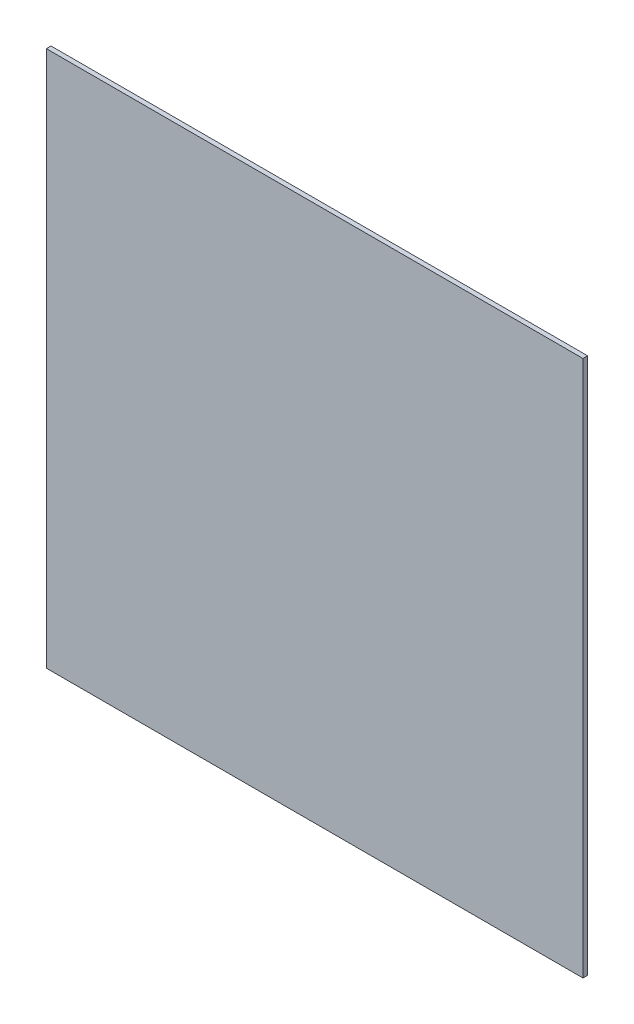
ISO-10303-21;
HEADER;
FILE_DESCRIPTION(('STEP AP214'),'2;1');
FILE_NAME('part.step','',(''),(''),'','','');
FILE_SCHEMA(('AUTOMOTIVE_DESIGN { 1 0 10303 214 1 1 1 1 }'));
ENDSEC;
DATA;
#1=APPLICATION_CONTEXT('core data for automotive mechanical design processes');
#2=APPLICATION_PROTOCOL_DEFINITION('international standard','automotive_design',2000,#1);
#3=PRODUCT_CONTEXT('',#1,'mechanical');
#4=PRODUCT('Part','Part','',(#3));
#5=PRODUCT_RELATED_PRODUCT_CATEGORY('part','',(#4));
#6=PRODUCT_DEFINITION_FORMATION('','',#4);
#7=PRODUCT_DEFINITION_CONTEXT('part definition',#1,'design');
#8=PRODUCT_DEFINITION('design','',#6,#7);
#9=PRODUCT_DEFINITION_SHAPE('','',#8);
#10=(LENGTH_UNIT() NAMED_UNIT(*) SI_UNIT(.MILLI.,.METRE.));
#11=(NAMED_UNIT(*) PLANE_ANGLE_UNIT() SI_UNIT($,.RADIAN.));
#12=(NAMED_UNIT(*) SI_UNIT($,.STERADIAN.) SOLID_ANGLE_UNIT());
#13=UNCERTAINTY_MEASURE_WITH_UNIT(LENGTH_MEASURE(1.E-05),#10,'distance_accuracy_value','');
#14=(GEOMETRIC_REPRESENTATION_CONTEXT(3) GLOBAL_UNCERTAINTY_ASSIGNED_CONTEXT((#13)) GLOBAL_UNIT_ASSIGNED_CONTEXT((#10,
#11,#12)) REPRESENTATION_CONTEXT('',''));
#15=CARTESIAN_POINT('',(0.,0.,0.));
#16=DIRECTION('',(0.,0.,1.));
#17=DIRECTION('',(1.,0.,0.));
#18=AXIS2_PLACEMENT_3D('',#15,#16,#17);
#19=CARTESIAN_POINT('',(-63.65,127.3,1.1));
#20=DIRECTION('',(1.,0.,0.));
#21=DIRECTION('',(0.,1.,0.));
#22=AXIS2_PLACEMENT_3D('',#19,#20,#21);
#23=PLANE('',#22);
#24=DIRECTION('',(0.,-1.,0.));
#25=VECTOR('',#24,1.);
#26=CARTESIAN_POINT('',(-63.65,127.3,0.));
#27=LINE('',#26,#25);
#28=CARTESIAN_POINT('',(-63.65,127.3,0.));
#29=VERTEX_POINT('',#28);
#30=CARTESIAN_POINT('',(-63.65,0.,0.));
#31=VERTEX_POINT('',#30);
#32=EDGE_CURVE('E107',#29,#31,#27,.T.);
#33=ORIENTED_EDGE('',*,*,#32,.T.);
#34=DIRECTION('',(0.,0.,-1.));
#35=VECTOR('',#34,1.);
#36=CARTESIAN_POINT('',(-63.65,0.,1.1));
#37=LINE('',#36,#35);
#38=CARTESIAN_POINT('',(-63.65,0.,1.1));
#39=VERTEX_POINT('',#38);
#40=EDGE_CURVE('E11',#39,#31,#37,.T.);
#41=ORIENTED_EDGE('',*,*,#40,.F.);
#42=DIRECTION('',(0.,-1.,0.));
#43=VECTOR('',#42,1.);
#44=CARTESIAN_POINT('',(-63.65,127.3,1.1));
#45=LINE('',#44,#43);
#46=CARTESIAN_POINT('',(-63.65,127.3,1.1));
#47=VERTEX_POINT('',#46);
#48=EDGE_CURVE('E91',#47,#39,#45,.T.);
#49=ORIENTED_EDGE('',*,*,#48,.F.);
#50=DIRECTION('',(0.,0.,-1.));
#51=VECTOR('',#50,1.);
#52=CARTESIAN_POINT('',(-63.65,127.3,1.1));
#53=LINE('',#52,#51);
#54=EDGE_CURVE('E103',#47,#29,#53,.T.);
#55=ORIENTED_EDGE('',*,*,#54,.T.);
#56=EDGE_LOOP('',(#33,#41,#49,#55));
#57=FACE_BOUND('',#56,.T.);
#58=ADVANCED_FACE('F39',(#57),#23,.F.);
#59=CARTESIAN_POINT('',(-63.65,0.,1.1));
#60=DIRECTION('',(0.,1.,0.));
#61=DIRECTION('',(-1.,0.,0.));
#62=AXIS2_PLACEMENT_3D('',#59,#60,#61);
#63=PLANE('',#62);
#64=DIRECTION('',(1.,0.,0.));
#65=VECTOR('',#64,1.);
#66=CARTESIAN_POINT('',(-63.65,0.,0.));
#67=LINE('',#66,#65);
#68=CARTESIAN_POINT('',(63.65,0.,0.));
#69=VERTEX_POINT('',#68);
#70=EDGE_CURVE('E96',#31,#69,#67,.T.);
#71=ORIENTED_EDGE('',*,*,#70,.T.);
#72=DIRECTION('',(0.,0.,-1.));
#73=VECTOR('',#72,1.);
#74=CARTESIAN_POINT('',(63.65,0.,1.1));
#75=LINE('',#74,#73);
#76=CARTESIAN_POINT('',(63.65,0.,1.1));
#77=VERTEX_POINT('',#76);
#78=EDGE_CURVE('E48',#77,#69,#75,.T.);
#79=ORIENTED_EDGE('',*,*,#78,.F.);
#80=DIRECTION('',(1.,0.,0.));
#81=VECTOR('',#80,1.);
#82=CARTESIAN_POINT('',(-63.65,0.,1.1));
#83=LINE('',#82,#81);
#84=EDGE_CURVE('E86',#39,#77,#83,.T.);
#85=ORIENTED_EDGE('',*,*,#84,.F.);
#86=ORIENTED_EDGE('',*,*,#40,.T.);
#87=EDGE_LOOP('',(#71,#79,#85,#86));
#88=FACE_BOUND('',#87,.T.);
#89=ADVANCED_FACE('F95',(#88),#63,.F.);
#90=CARTESIAN_POINT('',(63.65,127.3,1.1));
#91=DIRECTION('',(-1.,0.,0.));
#92=DIRECTION('',(0.,-1.,0.));
#93=AXIS2_PLACEMENT_3D('',#90,#91,#92);
#94=PLANE('',#93);
#95=DIRECTION('',(0.,1.,0.));
#96=VECTOR('',#95,1.);
#97=CARTESIAN_POINT('',(63.65,127.3,0.));
#98=LINE('',#97,#96);
#99=CARTESIAN_POINT('',(63.65,127.3,0.));
#100=VERTEX_POINT('',#99);
#101=EDGE_CURVE('E73',#69,#100,#98,.T.);
#102=ORIENTED_EDGE('',*,*,#101,.T.);
#103=DIRECTION('',(0.,0.,-1.));
#104=VECTOR('',#103,1.);
#105=CARTESIAN_POINT('',(63.65,127.3,1.1));
#106=LINE('',#105,#104);
#107=CARTESIAN_POINT('',(63.65,127.3,1.1));
#108=VERTEX_POINT('',#107);
#109=EDGE_CURVE('E98',#108,#100,#106,.T.);
#110=ORIENTED_EDGE('',*,*,#109,.F.);
#111=DIRECTION('',(0.,1.,0.));
#112=VECTOR('',#111,1.);
#113=CARTESIAN_POINT('',(63.65,127.3,1.1));
#114=LINE('',#113,#112);
#115=EDGE_CURVE('E89',#77,#108,#114,.T.);
#116=ORIENTED_EDGE('',*,*,#115,.F.);
#117=ORIENTED_EDGE('',*,*,#78,.T.);
#118=EDGE_LOOP('',(#102,#110,#116,#117));
#119=FACE_BOUND('',#118,.T.);
#120=ADVANCED_FACE('F99',(#119),#94,.F.);
#121=CARTESIAN_POINT('',(-63.65,127.3,1.1));
#122=DIRECTION('',(0.,-1.,0.));
#123=DIRECTION('',(1.,0.,0.));
#124=AXIS2_PLACEMENT_3D('',#121,#122,#123);
#125=PLANE('',#124);
#126=DIRECTION('',(-1.,0.,0.));
#127=VECTOR('',#126,1.);
#128=CARTESIAN_POINT('',(-63.65,127.3,0.));
#129=LINE('',#128,#127);
#130=EDGE_CURVE('E79',#100,#29,#129,.T.);
#131=ORIENTED_EDGE('',*,*,#130,.T.);
#132=ORIENTED_EDGE('',*,*,#54,.F.);
#133=DIRECTION('',(-1.,0.,0.));
#134=VECTOR('',#133,1.);
#135=CARTESIAN_POINT('',(-63.65,127.3,1.1));
#136=LINE('',#135,#134);
#137=EDGE_CURVE('E56',#108,#47,#136,.T.);
#138=ORIENTED_EDGE('',*,*,#137,.F.);
#139=ORIENTED_EDGE('',*,*,#109,.T.);
#140=EDGE_LOOP('',(#131,#132,#138,#139));
#141=FACE_BOUND('',#140,.T.);
#142=ADVANCED_FACE('F120',(#141),#125,.F.);
#143=CARTESIAN_POINT('',(0.,0.,1.1));
#144=DIRECTION('',(0.,0.,1.));
#145=DIRECTION('',(1.,0.,0.));
#146=AXIS2_PLACEMENT_3D('',#143,#144,#145);
#147=PLANE('',#146);
#148=ORIENTED_EDGE('',*,*,#48,.T.);
#149=ORIENTED_EDGE('',*,*,#84,.T.);
#150=ORIENTED_EDGE('',*,*,#115,.T.);
#151=ORIENTED_EDGE('',*,*,#137,.T.);
#152=EDGE_LOOP('',(#148,#149,#150,#151));
#153=FACE_BOUND('',#152,.T.);
#154=ADVANCED_FACE('F87',(#153),#147,.T.);
#155=CARTESIAN_POINT('',(0.,0.,0.));
#156=DIRECTION('',(0.,0.,1.));
#157=DIRECTION('',(1.,0.,0.));
#158=AXIS2_PLACEMENT_3D('',#155,#156,#157);
#159=PLANE('',#158);
#160=ORIENTED_EDGE('',*,*,#32,.F.);
#161=ORIENTED_EDGE('',*,*,#130,.F.);
#162=ORIENTED_EDGE('',*,*,#101,.F.);
#163=ORIENTED_EDGE('',*,*,#70,.F.);
#164=EDGE_LOOP('',(#160,#161,#162,#163));
#165=FACE_BOUND('',#164,.T.);
#166=ADVANCED_FACE('F123',(#165),#159,.F.);
#167=CLOSED_SHELL('',(#58,#89,#120,#142,#154,#166));
#168=MANIFOLD_SOLID_BREP('B2',#167);
#169=ADVANCED_BREP_SHAPE_REPRESENTATION('',(#18,#168),#14);
#170=SHAPE_DEFINITION_REPRESENTATION(#9,#169);
ENDSEC;
END-ISO-10303-21;
